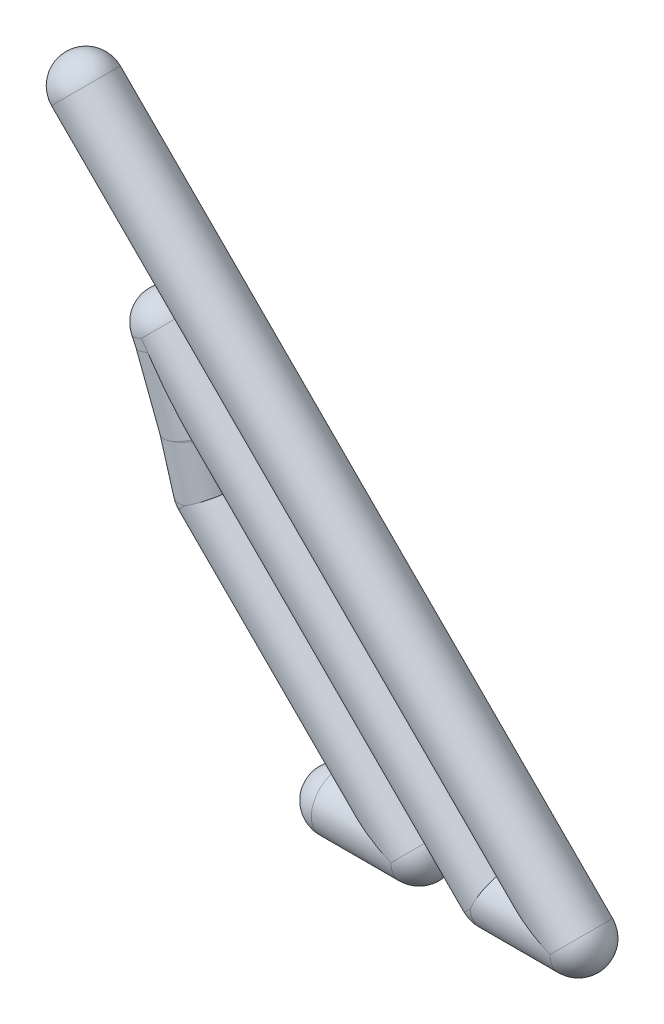
ISO-10303-21;
HEADER;
FILE_DESCRIPTION(('STEP AP214'),'2;1');
FILE_NAME('part.step','',(''),(''),'','','');
FILE_SCHEMA(('AUTOMOTIVE_DESIGN { 1 0 10303 214 1 1 1 1 }'));
ENDSEC;
DATA;
#1=APPLICATION_CONTEXT('core data for automotive mechanical design processes');
#2=APPLICATION_PROTOCOL_DEFINITION('international standard','automotive_design',2000,#1);
#3=PRODUCT_CONTEXT('',#1,'mechanical');
#4=PRODUCT('Part','Part','',(#3));
#5=PRODUCT_RELATED_PRODUCT_CATEGORY('part','',(#4));
#6=PRODUCT_DEFINITION_FORMATION('','',#4);
#7=PRODUCT_DEFINITION_CONTEXT('part definition',#1,'design');
#8=PRODUCT_DEFINITION('design','',#6,#7);
#9=PRODUCT_DEFINITION_SHAPE('','',#8);
#10=(LENGTH_UNIT() NAMED_UNIT(*) SI_UNIT(.MILLI.,.METRE.));
#11=(NAMED_UNIT(*) PLANE_ANGLE_UNIT() SI_UNIT($,.RADIAN.));
#12=(NAMED_UNIT(*) SI_UNIT($,.STERADIAN.) SOLID_ANGLE_UNIT());
#13=UNCERTAINTY_MEASURE_WITH_UNIT(LENGTH_MEASURE(1.E-05),#10,'distance_accuracy_value','');
#14=(GEOMETRIC_REPRESENTATION_CONTEXT(3) GLOBAL_UNCERTAINTY_ASSIGNED_CONTEXT((#13)) GLOBAL_UNIT_ASSIGNED_CONTEXT((#10,
#11,#12)) REPRESENTATION_CONTEXT('',''));
#15=CARTESIAN_POINT('',(0.,0.,0.));
#16=DIRECTION('',(0.,0.,1.));
#17=DIRECTION('',(1.,0.,0.));
#18=AXIS2_PLACEMENT_3D('',#15,#16,#17);
#19=CARTESIAN_POINT('',(15.78,-16.492,2.475));
#20=DIRECTION('',(-0.707106781186548,0.707106781186548,0.));
#21=DIRECTION('',(-0.707106781186548,-0.707106781186548,0.));
#22=AXIS2_PLACEMENT_3D('',#19,#20,#21);
#23=CYLINDRICAL_SURFACE('',#22,0.24);
#24=CARTESIAN_POINT('',(11.582,-12.294,2.475));
#25=DIRECTION('',(-0.707106781186548,0.707106781186548,0.));
#26=DIRECTION('',(-0.707106781186548,-0.707106781186548,0.));
#27=AXIS2_PLACEMENT_3D('',#24,#25,#26);
#28=CIRCLE('',#27,0.24);
#29=CARTESIAN_POINT('',(11.4122943725152,-12.4637056274848,2.475));
#30=VERTEX_POINT('',#29);
#31=EDGE_CURVE('E321',#30,#30,#28,.F.);
#32=ORIENTED_EDGE('',*,*,#31,.T.);
#33=EDGE_LOOP('',(#32));
#34=FACE_BOUND('',#33,.T.);
#35=CARTESIAN_POINT('',(15.78,-16.492,2.475));
#36=DIRECTION('',(0.38268343236509,0.923879532511287,0.));
#37=DIRECTION('',(-0.923879532511287,0.38268343236509,0.));
#38=AXIS2_PLACEMENT_3D('',#35,#36,#37);
#39=ELLIPSE('',#38,0.627150223140661,0.24);
#40=CARTESIAN_POINT('',(15.78,-16.492,2.715));
#41=VERTEX_POINT('',#40);
#42=CARTESIAN_POINT('',(15.78,-16.492,2.235));
#43=VERTEX_POINT('',#42);
#44=EDGE_CURVE('E12',#41,#43,#39,.F.);
#45=ORIENTED_EDGE('',*,*,#44,.F.);
#46=CARTESIAN_POINT('',(15.78,-16.492,2.475));
#47=DIRECTION('',(-0.707106781186547,0.707106781186548,0.));
#48=DIRECTION('',(-0.707106781186548,-0.707106781186547,0.));
#49=AXIS2_PLACEMENT_3D('',#46,#47,#48);
#50=CIRCLE('',#49,0.24);
#51=EDGE_CURVE('E298',#41,#43,#50,.T.);
#52=ORIENTED_EDGE('',*,*,#51,.T.);
#53=EDGE_LOOP('',(#45,#52));
#54=FACE_BOUND('',#53,.T.);
#55=CARTESIAN_POINT('',(12.0393039005138,-13.0902283468249,2.4878495781095));
#56=CARTESIAN_POINT('',(12.1524299571834,-13.2033745511837,2.48753672881311));
#57=CARTESIAN_POINT('',(12.2655569624466,-13.3165217046656,2.487272545384));
#58=CARTESIAN_POINT('',(12.8311943433347,-13.8822598284135,2.48603924299405));
#59=CARTESIAN_POINT('',(13.2837116934356,-14.3348577784387,2.48533296853145));
#60=CARTESIAN_POINT('',(13.9624524899331,-15.0137194662545,2.48170438851958));
#61=CARTESIAN_POINT('',(14.1886935709239,-15.2400008429269,2.48006666686748));
#62=CARTESIAN_POINT('',(14.5280994127774,-15.5794671363868,2.47944002725329));
#63=CARTESIAN_POINT('',(14.6412422883741,-15.6926301639063,2.47953613986878));
#64=CARTESIAN_POINT('',(14.7578709662125,-15.809279614508,2.47593903443946));
#65=CARTESIAN_POINT('',(14.7614051398877,-15.8128144176557,2.47582653042368));
#66=CARTESIAN_POINT('',(14.7667063606682,-15.8181165826379,2.47560125357452));
#67=CARTESIAN_POINT('',(14.7684734567371,-15.8198839934447,2.47551673929685));
#68=CARTESIAN_POINT('',(14.770679008299,-15.822089937838,2.47533368831303));
#69=CARTESIAN_POINT('',(14.7711199639117,-15.8225309719894,2.47529320651379));
#70=CARTESIAN_POINT('',(14.771780741807,-15.823191867576,2.47521204563451));
#71=CARTESIAN_POINT('',(14.7720009194677,-15.8234120844526,2.47518158053352));
#72=CARTESIAN_POINT('',(14.7722737258936,-15.8236849394681,2.4751192615739));
#73=CARTESIAN_POINT('',(14.7723281745299,-15.8237393978022,2.47510558354908));
#74=CARTESIAN_POINT('',(14.7724087442519,-15.8238199818746,2.47507721028868));
#75=CARTESIAN_POINT('',(14.7724354312566,-15.8238466736325,2.47506643511317));
#76=CARTESIAN_POINT('',(14.772467744564,-15.8238789926953,2.47504848788414));
#77=CARTESIAN_POINT('',(14.7724742443439,-15.8238854936328,2.47504461518583));
#78=CARTESIAN_POINT('',(14.772486591039,-15.823897842527,2.47503518233933));
#79=CARTESIAN_POINT('',(14.7724924462692,-15.8239036988,2.47502964831281));
#80=CARTESIAN_POINT('',(14.7724983767957,-15.8239096303828,2.4750216825582));
#81=CARTESIAN_POINT('',(14.7724992462219,-15.8239104999639,2.4750204410701));
#82=CARTESIAN_POINT('',(14.7725008948613,-15.8239121488969,2.47501784958273));
#83=CARTESIAN_POINT('',(14.7725016744121,-15.8239129285866,2.47501650002406));
#84=CARTESIAN_POINT('',(14.772503100867,-15.8239143552955,2.47501364917537));
#85=CARTESIAN_POINT('',(14.7725037469108,-15.8239150014544,2.47501214698896));
#86=CARTESIAN_POINT('',(14.7725048524285,-15.823916107169,2.47500898514142));
#87=CARTESIAN_POINT('',(14.7725053089725,-15.8239165637943,2.47500732346378));
#88=CARTESIAN_POINT('',(14.7725056359596,-15.8239168908396,2.475005598285));
#89=B_SPLINE_CURVE_WITH_KNOTS('',3,(#55,#56,#57,#58,#59,#60,#61,#62,#63,#64,#65,#66,#67,#68,#69,
#70,#71,#72,#73,#74,#75,#76,#77,#78,#79,#80,#81,#82,#83,#84,#85,#86,#87,#88),.UNSPECIFIED.,.F.,
.F.,(4,2,2,2,2,2,2,2,2,2,2,2,2,2,2,2,4),(0.,0.480000000731884,2.40000012987557,3.36000036645926,
3.84000239278193,3.85500253751842,3.86250285689826,3.86437800043716,3.86531580783986,
3.86555030657064,3.86566768448352,3.86569758579388,3.86572703960308,3.86573227709549,
3.86573749422714,3.8657427439962,3.86574807215659),.UNSPECIFIED.);
#90=CARTESIAN_POINT('',(14.7725018046118,-15.8239130588105,2.47501144259092));
#91=VERTEX_POINT('',#90);
#92=CARTESIAN_POINT('',(12.4635301856548,-13.5145301883429,2.48681097323635));
#93=VERTEX_POINT('',#92);
#94=EDGE_CURVE('E98',#91,#93,#89,.F.);
#95=ORIENTED_EDGE('',*,*,#94,.F.);
#96=CARTESIAN_POINT('',(12.0393039005138,-13.0902283468249,2.46215042189051));
#97=CARTESIAN_POINT('',(12.1524299571834,-13.2033745511837,2.46246327118689));
#98=CARTESIAN_POINT('',(12.2655569624466,-13.3165217046656,2.462727454616));
#99=CARTESIAN_POINT('',(12.8311943433347,-13.8822598284135,2.46396075700596));
#100=CARTESIAN_POINT('',(13.2837116934356,-14.3348577784387,2.46466703146856));
#101=CARTESIAN_POINT('',(13.9624524899331,-15.0137194662545,2.46829561148042));
#102=CARTESIAN_POINT('',(14.1886935709239,-15.2400008429269,2.46993333313251));
#103=CARTESIAN_POINT('',(14.5280994127774,-15.5794671363868,2.47055997274671));
#104=CARTESIAN_POINT('',(14.6412422883741,-15.6926301639063,2.47046386013123));
#105=CARTESIAN_POINT('',(14.7578709662125,-15.809279614508,2.47406096556055));
#106=CARTESIAN_POINT('',(14.7614051398877,-15.8128144176557,2.47417346957632));
#107=CARTESIAN_POINT('',(14.7667063606682,-15.8181165826379,2.47439874642548));
#108=CARTESIAN_POINT('',(14.7684734567371,-15.8198839934447,2.47448326070315));
#109=CARTESIAN_POINT('',(14.770679008299,-15.822089937838,2.47466631168697));
#110=CARTESIAN_POINT('',(14.7711199639117,-15.8225309719894,2.47470679348621));
#111=CARTESIAN_POINT('',(14.771780741807,-15.823191867576,2.47478795436549));
#112=CARTESIAN_POINT('',(14.7720009194677,-15.8234120844526,2.47481841946648));
#113=CARTESIAN_POINT('',(14.7722737258936,-15.8236849394681,2.4748807384261));
#114=CARTESIAN_POINT('',(14.7723281745299,-15.8237393978022,2.47489441645092));
#115=CARTESIAN_POINT('',(14.7724087442519,-15.8238199818746,2.47492278971132));
#116=CARTESIAN_POINT('',(14.7724354312566,-15.8238466736325,2.47493356488683));
#117=CARTESIAN_POINT('',(14.772467744564,-15.8238789926953,2.47495151211586));
#118=CARTESIAN_POINT('',(14.7724742443439,-15.8238854936328,2.47495538481417));
#119=CARTESIAN_POINT('',(14.772486591039,-15.823897842527,2.47496481766067));
#120=CARTESIAN_POINT('',(14.7724924462692,-15.8239036988,2.47497035168719));
#121=CARTESIAN_POINT('',(14.7724983767957,-15.8239096303828,2.4749783174418));
#122=CARTESIAN_POINT('',(14.7724992462219,-15.8239104999639,2.4749795589299));
#123=CARTESIAN_POINT('',(14.7725008948613,-15.8239121488969,2.47498215041727));
#124=CARTESIAN_POINT('',(14.7725016744121,-15.8239129285866,2.47498349997594));
#125=CARTESIAN_POINT('',(14.772503100867,-15.8239143552955,2.47498635082463));
#126=CARTESIAN_POINT('',(14.7725037469108,-15.8239150014544,2.47498785301104));
#127=CARTESIAN_POINT('',(14.7725048524285,-15.823916107169,2.47499101485858));
#128=CARTESIAN_POINT('',(14.7725053089725,-15.8239165637943,2.47499267653622));
#129=CARTESIAN_POINT('',(14.7725056359596,-15.8239168908396,2.474994401715));
#130=B_SPLINE_CURVE_WITH_KNOTS('',3,(#96,#97,#98,#99,#100,#101,#102,#103,#104,#105,#106,#107,
#108,#109,#110,#111,#112,#113,#114,#115,#116,#117,#118,#119,#120,#121,#122,#123,#124,#125,#126,
#127,#128,#129),.UNSPECIFIED.,.F.,.F.,(4,2,2,2,2,2,2,2,2,2,2,2,2,2,2,2,4),(0.,0.480000000731884,
2.40000012987557,3.36000036645926,3.84000239278193,3.85500253751842,3.86250285689826,
3.86437800043716,3.86531580783986,3.86555030657064,3.86566768448352,3.86569758579388,
3.86572703960308,3.86573227709549,3.86573749422714,3.8657427439962,3.86574807215659),.UNSPECIFIED.);
#131=CARTESIAN_POINT('',(12.4635301856548,-13.514530188343,2.4631890267633));
#132=VERTEX_POINT('',#131);
#133=EDGE_CURVE('E85',#132,#91,#130,.T.);
#134=ORIENTED_EDGE('',*,*,#133,.F.);
#135=CARTESIAN_POINT('',(12.4639358484132,-13.5149364095001,2.48680295689125));
#136=CARTESIAN_POINT('',(12.4631987723173,-13.5141972973782,2.48682937850623));
#137=CARTESIAN_POINT('',(12.4624571718997,-13.5134587462612,2.4867881558701));
#138=CARTESIAN_POINT('',(12.4609733066918,-13.5119904270471,2.4865640456576));
#139=CARTESIAN_POINT('',(12.4602310984285,-13.511260802041,2.48637985966248));
#140=CARTESIAN_POINT('',(12.4587670353833,-13.5098306726624,2.48586222887949));
#141=CARTESIAN_POINT('',(12.4580452247035,-13.5091302300351,2.48552848359803));
#142=CARTESIAN_POINT('',(12.4566479009671,-13.5077823214639,2.48470033894227));
#143=CARTESIAN_POINT('',(12.4559722348691,-13.5071346788663,2.48420650532086));
#144=CARTESIAN_POINT('',(12.4549171285198,-13.5061286090831,2.48324200875173));
#145=CARTESIAN_POINT('',(12.4545150701523,-13.5057467084271,2.4828205389861));
#146=CARTESIAN_POINT('',(12.4537607039294,-13.505032363729,2.481898063243));
#147=CARTESIAN_POINT('',(12.4534083358202,-13.5046998597624,2.48139715518576));
#148=CARTESIAN_POINT('',(12.4528353179219,-13.5041604862111,2.48042248855023));
#149=CARTESIAN_POINT('',(12.4526023855642,-13.5039417640439,2.47996258826228));
#150=CARTESIAN_POINT('',(12.4521939849588,-13.5035588661209,2.47899642802723));
#151=CARTESIAN_POINT('',(12.452018485011,-13.5033946602741,2.47849019385236));
#152=CARTESIAN_POINT('',(12.4517363797707,-13.5031309546922,2.47743723003212));
#153=CARTESIAN_POINT('',(12.4516303898041,-13.5030320328257,2.47689018522285));
#154=CARTESIAN_POINT('',(12.4514998026473,-13.5029101799448,2.47577824838828));
#155=CARTESIAN_POINT('',(12.4514751320015,-13.50288718035,2.47521337293532));
#156=CARTESIAN_POINT('',(12.4515069903254,-13.5029168971568,2.47416816217031));
#157=CARTESIAN_POINT('',(12.4515525644539,-13.5029593984269,2.47368713313492));
#158=CARTESIAN_POINT('',(12.4517018593904,-13.5030987552891,2.47274241084046));
#159=CARTESIAN_POINT('',(12.4518055861321,-13.5031956164279,2.4722787193556));
#160=CARTESIAN_POINT('',(12.4520651619385,-13.5034383403056,2.47137673208784));
#161=CARTESIAN_POINT('',(12.4522213232091,-13.5035844965817,2.47093860732517));
#162=CARTESIAN_POINT('',(12.4525771509879,-13.5039181058968,2.47009740209588));
#163=CARTESIAN_POINT('',(12.4527768377488,-13.5041055781609,2.4696943380659));
#164=CARTESIAN_POINT('',(12.453320490076,-13.5046170282519,2.46873401134771));
#165=CARTESIAN_POINT('',(12.4536866298877,-13.5049623508091,2.46820061026836));
#166=CARTESIAN_POINT('',(12.4544750207811,-13.505708669451,2.46722140318395));
#167=CARTESIAN_POINT('',(12.4548973959513,-13.5061097887466,2.46677579645888));
#168=CARTESIAN_POINT('',(12.455949994154,-13.5071134784674,2.46581414914046));
#169=CARTESIAN_POINT('',(12.4565978365707,-13.5077343387704,2.4653365648124));
#170=CARTESIAN_POINT('',(12.4579365796717,-13.5090251479475,2.46452946027233));
#171=CARTESIAN_POINT('',(12.4586275888467,-13.5096952213164,2.46420033174139));
#172=CARTESIAN_POINT('',(12.4600869823975,-13.5111193788772,2.46365973550469));
#173=CARTESIAN_POINT('',(12.4608571546831,-13.5118759096217,2.46345968139108));
#174=CARTESIAN_POINT('',(12.4623985729549,-13.5134003827393,2.46321527796484));
#175=CARTESIAN_POINT('',(12.4631697592889,-13.5141681823022,2.46316967580611));
#176=CARTESIAN_POINT('',(12.4639358484132,-13.5149364095001,2.46319704310864));
#177=B_SPLINE_CURVE_WITH_KNOTS('',3,(#135,#136,#137,#138,#139,#140,#141,#142,#143,#144,#145,
#146,#147,#148,#149,#150,#151,#152,#153,#154,#155,#156,#157,#158,#159,#160,#161,#162,#163,#164,
#165,#166,#167,#168,#169,#170,#171,#172,#173,#174,#175,#176),.UNSPECIFIED.,.F.,.F.,(4,2,2,2,2,2,
2,2,2,2,2,2,2,2,2,2,2,2,2,2,4),(0.,0.00313198407615698,0.00629275107383918,0.00945989733780664,
0.0126159707307906,0.0146991402544303,0.0167797616213369,0.0184533603700822,0.020126033808029,
0.0218133213112893,0.0234990842758988,0.0249472415691489,0.0263955466544461,0.0278526328508719,
0.0293103984956399,0.0314981873519733,0.0336908863523824,0.036723929795061,0.0397649293748683,
0.0430473194972195,0.0463030197179651),.UNSPECIFIED.);
#178=EDGE_CURVE('E102',#93,#132,#177,.T.);
#179=ORIENTED_EDGE('',*,*,#178,.F.);
#180=EDGE_LOOP('',(#95,#134,#179));
#181=FACE_BOUND('',#180,.T.);
#182=ADVANCED_FACE('F81',(#34,#54,#181),#23,.T.);
#183=CARTESIAN_POINT('',(11.582,-12.294,2.475));
#184=DIRECTION('',(1.,0.,0.));
#185=DIRECTION('',(0.,-1.,0.));
#186=AXIS2_PLACEMENT_3D('',#183,#184,#185);
#187=SPHERICAL_SURFACE('',#186,0.24);
#188=CARTESIAN_POINT('',(11.582,-12.294,2.475));
#189=DIRECTION('',(-0.707106781186548,0.707106781186548,0.));
#190=DIRECTION('',(-0.707106781186548,-0.707106781186548,0.));
#191=AXIS2_PLACEMENT_3D('',#188,#189,#190);
#192=SPHERICAL_SURFACE('',#191,0.24);
#193=ORIENTED_EDGE('',*,*,#31,.F.);
#194=EDGE_LOOP('',(#193));
#195=FACE_BOUND('',#194,.T.);
#196=ADVANCED_FACE('F83',(#195),#192,.T.);
#197=CARTESIAN_POINT('',(15.78,-16.492,2.475));
#198=DIRECTION('',(1.,0.,0.));
#199=DIRECTION('',(0.,-1.,0.));
#200=AXIS2_PLACEMENT_3D('',#197,#198,#199);
#201=SPHERICAL_SURFACE('',#200,0.24);
#202=ORIENTED_EDGE('',*,*,#51,.F.);
#203=CARTESIAN_POINT('',(15.78,-16.492,2.475));
#204=DIRECTION('',(1.,0.,0.));
#205=DIRECTION('',(0.,0.,-1.));
#206=AXIS2_PLACEMENT_3D('',#203,#204,#205);
#207=CIRCLE('',#206,0.24);
#208=EDGE_CURVE('E292',#43,#41,#207,.F.);
#209=ORIENTED_EDGE('',*,*,#208,.F.);
#210=EDGE_LOOP('',(#202,#209));
#211=FACE_BOUND('',#210,.T.);
#212=ADVANCED_FACE('F312',(#211),#201,.T.);
#213=CARTESIAN_POINT('',(15.101,-16.492,2.475));
#214=DIRECTION('',(1.,0.,0.));
#215=DIRECTION('',(0.,0.,-1.));
#216=AXIS2_PLACEMENT_3D('',#213,#214,#215);
#217=CYLINDRICAL_SURFACE('',#216,0.24);
#218=CARTESIAN_POINT('',(15.101,-16.492,2.475));
#219=DIRECTION('',(0.923845451962555,-0.382765699727786,0.));
#220=DIRECTION('',(0.382765699727786,0.923845451962556,0.));
#221=AXIS2_PLACEMENT_3D('',#218,#219,#220);
#222=ELLIPSE('',#221,0.259783711106831,0.24);
#223=CARTESIAN_POINT('',(15.101,-16.492,2.715));
#224=VERTEX_POINT('',#223);
#225=CARTESIAN_POINT('',(15.101,-16.492,2.235));
#226=VERTEX_POINT('',#225);
#227=EDGE_CURVE('E295',#224,#226,#222,.F.);
#228=ORIENTED_EDGE('',*,*,#227,.F.);
#229=CARTESIAN_POINT('',(15.101,-16.492,2.475));
#230=DIRECTION('',(1.,0.,0.));
#231=DIRECTION('',(0.,0.,-1.));
#232=AXIS2_PLACEMENT_3D('',#229,#230,#231);
#233=CIRCLE('',#232,0.24);
#234=EDGE_CURVE('E290',#224,#226,#233,.T.);
#235=ORIENTED_EDGE('',*,*,#234,.T.);
#236=EDGE_LOOP('',(#228,#235));
#237=FACE_BOUND('',#236,.T.);
#238=ORIENTED_EDGE('',*,*,#208,.T.);
#239=ORIENTED_EDGE('',*,*,#44,.T.);
#240=EDGE_LOOP('',(#238,#239));
#241=FACE_BOUND('',#240,.T.);
#242=ADVANCED_FACE('F438',(#237,#241),#217,.T.);
#243=CARTESIAN_POINT('',(15.101,-16.492,2.475));
#244=DIRECTION('',(1.,0.,0.));
#245=DIRECTION('',(0.,-1.,0.));
#246=AXIS2_PLACEMENT_3D('',#243,#244,#245);
#247=SPHERICAL_SURFACE('',#246,0.24);
#248=ORIENTED_EDGE('',*,*,#234,.F.);
#249=CARTESIAN_POINT('',(15.101,-16.492,2.475));
#250=DIRECTION('',(0.706980838223797,-0.70723270172156,0.));
#251=DIRECTION('',(0.707232701721561,0.706980838223797,0.));
#252=AXIS2_PLACEMENT_3D('',#249,#250,#251);
#253=CIRCLE('',#252,0.24);
#254=EDGE_CURVE('E252',#226,#224,#253,.F.);
#255=ORIENTED_EDGE('',*,*,#254,.F.);
#256=EDGE_LOOP('',(#248,#255));
#257=FACE_BOUND('',#256,.T.);
#258=ADVANCED_FACE('F432',(#257),#247,.T.);
#259=CARTESIAN_POINT('',(12.294,-13.684,2.475));
#260=DIRECTION('',(0.706980838223797,-0.70723270172156,0.));
#261=DIRECTION('',(0.707232701721561,0.706980838223797,0.));
#262=AXIS2_PLACEMENT_3D('',#259,#260,#261);
#263=CYLINDRICAL_SURFACE('',#262,0.24);
#264=CARTESIAN_POINT('',(12.294,-13.684,2.475));
#265=DIRECTION('',(0.818362087522628,0.574702961281396,0.));
#266=DIRECTION('',(0.574702961281396,-0.818362087522628,0.));
#267=AXIS2_PLACEMENT_3D('',#264,#265,#266);
#268=ELLIPSE('',#267,1.39439556830279,0.24);
#269=CARTESIAN_POINT('',(12.294,-13.684,2.235));
#270=VERTEX_POINT('',#269);
#271=CARTESIAN_POINT('',(12.3475021843209,-13.7601857206203,2.23553548854484));
#272=VERTEX_POINT('',#271);
#273=EDGE_CURVE('E257',#270,#272,#268,.F.);
#274=ORIENTED_EDGE('',*,*,#273,.F.);
#275=CARTESIAN_POINT('',(12.294,-13.684,2.475));
#276=DIRECTION('',(0.706980838223797,-0.70723270172156,0.));
#277=DIRECTION('',(0.70723270172156,0.706980838223797,0.));
#278=AXIS2_PLACEMENT_3D('',#275,#276,#277);
#279=CIRCLE('',#278,0.24);
#280=EDGE_CURVE('E249',#270,#132,#279,.T.);
#281=ORIENTED_EDGE('',*,*,#280,.T.);
#282=ORIENTED_EDGE('',*,*,#133,.T.);
#283=ORIENTED_EDGE('',*,*,#94,.T.);
#284=CARTESIAN_POINT('',(12.294,-13.684,2.715));
#285=VERTEX_POINT('',#284);
#286=EDGE_CURVE('E248',#93,#285,#279,.T.);
#287=ORIENTED_EDGE('',*,*,#286,.T.);
#288=CARTESIAN_POINT('',(12.3475021843209,-13.7601857206203,2.71446451145516));
#289=VERTEX_POINT('',#288);
#290=EDGE_CURVE('E255',#289,#285,#268,.F.);
#291=ORIENTED_EDGE('',*,*,#290,.F.);
#292=CARTESIAN_POINT('',(12.3512972346505,-13.7672000000029,2.71430142332243));
#293=CARTESIAN_POINT('',(12.3505896999158,-13.7654506455223,2.71435727997294));
#294=CARTESIAN_POINT('',(12.3497459392057,-13.7637500847709,2.71440054885869));
#295=CARTESIAN_POINT('',(12.3477927691306,-13.7605148786719,2.71446325130046));
#296=CARTESIAN_POINT('',(12.3466839693351,-13.7589798641683,2.71448273893262));
#297=CARTESIAN_POINT('',(12.3441969268719,-13.7561271120126,2.71449951003613));
#298=CARTESIAN_POINT('',(12.3428171298655,-13.7548107126878,2.7144966615425));
#299=CARTESIAN_POINT('',(12.3398462408116,-13.75245054114,2.71446823439413));
#300=CARTESIAN_POINT('',(12.3382553518889,-13.7514065096581,2.71444267745775));
#301=CARTESIAN_POINT('',(12.3353630190706,-13.74982473294,2.71437712322332));
#302=CARTESIAN_POINT('',(12.3340945474018,-13.74922597786,2.71434264323666));
#303=CARTESIAN_POINT('',(12.3327999999995,-13.7487000360046,2.71430121461824));
#304=B_SPLINE_CURVE_WITH_KNOTS('',3,(#292,#293,#294,#295,#296,#297,#298,#299,#300,#301,#302,
#303),.UNSPECIFIED.,.F.,.F.,(4,2,2,2,2,4),(0.,0.00566668208227649,0.0113204545520082,
0.0170076553668594,0.0226894227874552,0.0268867331951387),.UNSPECIFIED.);
#305=CARTESIAN_POINT('',(12.3481927950135,-13.7612096425539,2.71444863904463));
#306=VERTEX_POINT('',#305);
#307=EDGE_CURVE('E203',#306,#289,#304,.T.);
#308=ORIENTED_EDGE('',*,*,#307,.F.);
#309=CARTESIAN_POINT('',(12.3059058378624,-13.6959100793436,2.475));
#310=DIRECTION('',(0.839369015949132,0.543562006641916,0.));
#311=DIRECTION('',(0.543562006641915,-0.839369015949132,0.));
#312=AXIS2_PLACEMENT_3D('',#309,#310,#311);
#313=ELLIPSE('',#312,1.14836390891025,0.24);
#314=CARTESIAN_POINT('',(12.6759483076814,-14.2673300460742,2.66828037472497));
#315=VERTEX_POINT('',#314);
#316=EDGE_CURVE('E194',#315,#306,#313,.F.);
#317=ORIENTED_EDGE('',*,*,#316,.F.);
#318=CARTESIAN_POINT('',(12.7024780718465,-14.3182,2.6543507864497));
#319=CARTESIAN_POINT('',(12.69771987641,-14.306610555522,2.65861577034415));
#320=CARTESIAN_POINT('',(12.6921657520016,-14.2950297868883,2.66208179574257));
#321=CARTESIAN_POINT('',(12.6795944504754,-14.2726112803398,2.66748150140746));
#322=CARTESIAN_POINT('',(12.672606476876,-14.2617637156115,2.66944254236587));
#323=CARTESIAN_POINT('',(12.6624084846489,-14.2481372367059,2.67115785247798));
#324=CARTESIAN_POINT('',(12.6598790232747,-14.2449089766992,2.67150445367551));
#325=CARTESIAN_POINT('',(12.654657429442,-14.2385425674204,2.67206899318749));
#326=CARTESIAN_POINT('',(12.6519644145487,-14.2354050725672,2.67228614958679));
#327=CARTESIAN_POINT('',(12.6491993853876,-14.2323272717522,2.67243827944999));
#328=B_SPLINE_CURVE_WITH_KNOTS('',3,(#318,#319,#320,#321,#322,#323,#324,#325,#326,#327),
.UNSPECIFIED.,.F.,.F.,(4,2,2,2,4),(0.,0.039698903756807,0.0786577620085021,0.0910003747181637,
0.103416807080208),.UNSPECIFIED.);
#329=CARTESIAN_POINT('',(12.6820744631162,-14.2772137391823,2.66629760750582));
#330=VERTEX_POINT('',#329);
#331=EDGE_CURVE('E334',#330,#315,#328,.T.);
#332=ORIENTED_EDGE('',*,*,#331,.F.);
#333=CARTESIAN_POINT('',(12.3832512894844,-13.773283085455,2.475));
#334=DIRECTION('',(0.860143573998323,0.510051989614188,0.));
#335=DIRECTION('',(0.510051989614188,-0.860143573998323,0.));
#336=AXIS2_PLACEMENT_3D('',#333,#334,#335);
#337=ELLIPSE('',#336,0.970169007662572,0.24);
#338=CARTESIAN_POINT('',(12.878021568807,-14.607655825941,2.47893017614097));
#339=VERTEX_POINT('',#338);
#340=EDGE_CURVE('E339',#339,#330,#337,.F.);
#341=ORIENTED_EDGE('',*,*,#340,.F.);
#342=CARTESIAN_POINT('',(14.9314698156829,-16.6614698103198,2.48681101162417));
#343=CARTESIAN_POINT('',(14.8183428237852,-16.5483226705782,2.48651698186133));
#344=CARTESIAN_POINT('',(14.7052160426608,-16.4351757412739,2.48621903358582));
#345=CARTESIAN_POINT('',(14.1395826740654,-15.8694416304949,2.48466872854587));
#346=CARTESIAN_POINT('',(13.6870779045962,-15.4168562632065,2.48323468130219));
#347=CARTESIAN_POINT('',(13.1214421906677,-14.8511198034464,2.48054433337101));
#348=CARTESIAN_POINT('',(13.0083148025991,-14.7379722662823,2.4799613742963));
#349=CARTESIAN_POINT('',(12.8386294287434,-14.568256669739,2.47860940355299));
#350=CARTESIAN_POINT('',(12.7820685734551,-14.5116857403781,2.47807915774092));
#351=CARTESIAN_POINT('',(12.6972218592025,-14.4268239140547,2.47720353627049));
#352=CARTESIAN_POINT('',(12.6689386405468,-14.3985356578684,2.47689828606823));
#353=CARTESIAN_POINT('',(12.6371303241977,-14.3667216761321,2.47594180067841));
#354=CARTESIAN_POINT('',(12.6335961990328,-14.3631869215033,2.47582700915081));
#355=CARTESIAN_POINT('',(12.62829497629,-14.3578847545584,2.47560110385886));
#356=CARTESIAN_POINT('',(12.6265278671399,-14.3561173306681,2.47551684726686));
#357=CARTESIAN_POINT('',(12.6243223312181,-14.3539114019178,2.47533379765358));
#358=CARTESIAN_POINT('',(12.6238813803823,-14.3534703725441,2.47529330009577));
#359=CARTESIAN_POINT('',(12.6232205869151,-14.3528094613827,2.47521225167761));
#360=CARTESIAN_POINT('',(12.6230004004818,-14.352589235732,2.47518184680172));
#361=CARTESIAN_POINT('',(12.6227275995866,-14.3523163862482,2.47511957419025));
#362=CARTESIAN_POINT('',(12.6226731531772,-14.3522619301413,2.47510590407467));
#363=CARTESIAN_POINT('',(12.6225925506307,-14.3521813132386,2.47507773134989));
#364=CARTESIAN_POINT('',(12.6225658473644,-14.3521546052163,2.47506705497383));
#365=CARTESIAN_POINT('',(12.6225335192993,-14.3521222713931,2.47504924471142));
#366=CARTESIAN_POINT('',(12.622527029893,-14.352115780831,2.47504540913036));
#367=CARTESIAN_POINT('',(12.6225146436659,-14.3521033923978,2.47503616353439));
#368=CARTESIAN_POINT('',(12.6225087405355,-14.3520974882161,2.475030773475));
#369=CARTESIAN_POINT('',(12.6225025931524,-14.352091339738,2.4750229965608));
#370=CARTESIAN_POINT('',(12.6225016465445,-14.3520903929615,2.47502172568042));
#371=CARTESIAN_POINT('',(12.6224998445067,-14.3520885906028,2.47501906741477));
#372=CARTESIAN_POINT('',(12.6224989887284,-14.352087734672,2.47501768051415));
#373=CARTESIAN_POINT('',(12.6224974110944,-14.3520861567571,2.47501474213787));
#374=CARTESIAN_POINT('',(12.6224966901327,-14.3520854356669,2.47501318966402));
#375=CARTESIAN_POINT('',(12.6224954382964,-14.3520841836077,2.4750099107778));
#376=CARTESIAN_POINT('',(12.6224949103879,-14.3520836556052,2.47500818213435));
#377=CARTESIAN_POINT('',(12.6224945156532,-14.3520832608002,2.47500638012172));
#378=B_SPLINE_CURVE_WITH_KNOTS('',3,(#342,#343,#344,#345,#346,#347,#348,#349,#350,#351,#352,
#353,#354,#355,#356,#357,#358,#359,#360,#361,#362,#363,#364,#365,#366,#367,#368,#369,#370,#371,
#372,#373,#374,#375,#376,#377),.UNSPECIFIED.,.F.,.F.,(4,2,2,2,2,2,2,2,2,2,2,2,2,2,2,2,2,4),(0.,
0.48000000124425,2.40000029887847,2.88000041672578,3.12000060615711,3.24000134021893,
3.25500148491391,3.26250180403167,3.26437694722658,3.26531475266413,3.26554924920094,
3.26566661948691,3.26569643695495,3.26572588749487,3.26573142074869,3.2657369319431,
3.26574247847312,3.2657481069549),.UNSPECIFIED.);
#379=CARTESIAN_POINT('',(14.5925301856547,-16.3224698143453,2.48591019265634));
#380=VERTEX_POINT('',#379);
#381=EDGE_CURVE('E341',#380,#339,#378,.T.);
#382=ORIENTED_EDGE('',*,*,#381,.F.);
#383=CARTESIAN_POINT('',(14.5921543946064,-16.3220943725153,2.46409731526774));
#384=CARTESIAN_POINT('',(14.5927990476481,-16.3227376222487,2.46407397757091));
#385=CARTESIAN_POINT('',(14.5934433070484,-16.3233843238212,2.46410651362236));
#386=CARTESIAN_POINT('',(14.5947241527957,-16.3246772527908,2.46428781123502));
#387=CARTESIAN_POINT('',(14.5953606621413,-16.3253234498343,2.46443732621294));
#388=CARTESIAN_POINT('',(14.5966114049076,-16.3266002991643,2.46485778671681));
#389=CARTESIAN_POINT('',(14.5972256032117,-16.3272309264842,2.46512891540434));
#390=CARTESIAN_POINT('',(14.5984146813006,-16.3284582380469,2.4658010345371));
#391=CARTESIAN_POINT('',(14.5989896437721,-16.329054993196,2.46620174098436));
#392=CARTESIAN_POINT('',(14.5999339497249,-16.3300397352028,2.46701850112302));
#393=CARTESIAN_POINT('',(14.6003173312479,-16.3304410579976,2.46740217809416));
#394=CARTESIAN_POINT('',(14.6010384604879,-16.3311982899047,2.46824960730095));
#395=CARTESIAN_POINT('',(14.6013762601285,-16.331554250664,2.46871326703));
#396=CARTESIAN_POINT('',(14.6019241885895,-16.3321331167566,2.46961512200001));
#397=CARTESIAN_POINT('',(14.6021462260093,-16.3323682597177,2.47003815461667));
#398=CARTESIAN_POINT('',(14.6025399331537,-16.3327858720736,2.47093125551545));
#399=CARTESIAN_POINT('',(14.6027116638651,-16.3329684052429,2.47140126591104));
#400=CARTESIAN_POINT('',(14.6029723227325,-16.3332457487166,2.47230651692507));
#401=CARTESIAN_POINT('',(14.603069771776,-16.3333495729889,2.47273651717068));
#402=CARTESIAN_POINT('',(14.6032137811903,-16.3335030706601,2.47361439751246));
#403=CARTESIAN_POINT('',(14.6032603700431,-16.3335527743668,2.47406226745569));
#404=CARTESIAN_POINT('',(14.6032993547818,-16.3335943625722,2.47496407689919));
#405=CARTESIAN_POINT('',(14.6032916316605,-16.3335861201004,2.47541802755141));
#406=CARTESIAN_POINT('',(14.6032223014547,-16.3335121701116,2.47631701399338));
#407=CARTESIAN_POINT('',(14.6031606824612,-16.333446449894,2.47676204779057));
#408=CARTESIAN_POINT('',(14.6029904134509,-16.3332650373738,2.4776183593764));
#409=CARTESIAN_POINT('',(14.6028831606234,-16.3331508298363,2.47803023884564));
#410=CARTESIAN_POINT('',(14.6026280341904,-16.3328795320975,2.47882615028155));
#411=CARTESIAN_POINT('',(14.6024801428964,-16.3327224232228,2.47921017002959));
#412=CARTESIAN_POINT('',(14.6020807133591,-16.3322988154359,2.48010089885758));
#413=CARTESIAN_POINT('',(14.6018117554628,-16.3320141130837,2.48059116429912));
#414=CARTESIAN_POINT('',(14.6012221907531,-16.3313918777659,2.48150191457812));
#415=CARTESIAN_POINT('',(14.6009014910964,-16.3310542498644,2.48192227116771));
#416=CARTESIAN_POINT('',(14.6000938856879,-16.330206823384,2.4828399205835));
#417=CARTESIAN_POINT('',(14.5995898985953,-16.3296801005987,2.48330648101669));
#418=CARTESIAN_POINT('',(14.5985335099507,-16.3285815707222,2.48411897476856));
#419=CARTESIAN_POINT('',(14.5979809269091,-16.3280095955016,2.48446442959828));
#420=CARTESIAN_POINT('',(14.5965747640599,-16.3265618315044,2.48518017065556));
#421=CARTESIAN_POINT('',(14.5957030212092,-16.3256709263918,2.48548412736442));
#422=CARTESIAN_POINT('',(14.5939381660419,-16.3238814985864,2.48585959411276));
#423=CARTESIAN_POINT('',(14.5930454166335,-16.3229831825887,2.48593374726671));
#424=CARTESIAN_POINT('',(14.5921543946075,-16.3220943725164,2.48590268473648));
#425=B_SPLINE_CURVE_WITH_KNOTS('',3,(#383,#384,#385,#386,#387,#388,#389,#390,#391,#392,#393,
#394,#395,#396,#397,#398,#399,#400,#401,#402,#403,#404,#405,#406,#407,#408,#409,#410,#411,#412,
#413,#414,#415,#416,#417,#418,#419,#420,#421,#422,#423,#424),.UNSPECIFIED.,.F.,.F.,(4,2,2,2,2,2,
2,2,2,2,2,2,2,2,2,2,2,2,2,2,4),(0.,0.0027323724266401,0.00548248935988505,0.00823676220559053,
0.0109850389160248,0.0130029722409455,0.0150185871205046,0.0166101761659934,0.0181998276654848,
0.0195528270053464,0.0209050682687729,0.022260273456328,0.0236157781728873,0.0249324698709291,
0.026249735591709,0.0281217788984898,0.0299972194678809,0.032579642465643,0.0351721565889498,
0.0389976623378212,0.0427790020940546),.UNSPECIFIED.);
#426=CARTESIAN_POINT('',(14.5925301856548,-16.3224698143452,2.4640898073481));
#427=VERTEX_POINT('',#426);
#428=EDGE_CURVE('E348',#427,#380,#425,.T.);
#429=ORIENTED_EDGE('',*,*,#428,.F.);
#430=CARTESIAN_POINT('',(14.9314698156829,-16.6614698103198,2.46318898837583));
#431=CARTESIAN_POINT('',(14.8183428237852,-16.5483226705782,2.46348301813867));
#432=CARTESIAN_POINT('',(14.7052160426608,-16.4351757412739,2.46378096641418));
#433=CARTESIAN_POINT('',(14.1395826740654,-15.8694416304949,2.46533127145413));
#434=CARTESIAN_POINT('',(13.6870779045962,-15.4168562632065,2.46676531869781));
#435=CARTESIAN_POINT('',(13.1214421906677,-14.8511198034464,2.46945566662899));
#436=CARTESIAN_POINT('',(13.0083148025991,-14.7379722662823,2.4700386257037));
#437=CARTESIAN_POINT('',(12.8386294287434,-14.568256669739,2.47139059644701));
#438=CARTESIAN_POINT('',(12.7820685734551,-14.5116857403781,2.47192084225908));
#439=CARTESIAN_POINT('',(12.6972218592025,-14.4268239140547,2.47279646372951));
#440=CARTESIAN_POINT('',(12.6689386405468,-14.3985356578684,2.47310171393177));
#441=CARTESIAN_POINT('',(12.6371303241977,-14.3667216761321,2.47405819932159));
#442=CARTESIAN_POINT('',(12.6335961990328,-14.3631869215033,2.47417299084919));
#443=CARTESIAN_POINT('',(12.62829497629,-14.3578847545584,2.47439889614114));
#444=CARTESIAN_POINT('',(12.6265278671399,-14.3561173306681,2.47448315273314));
#445=CARTESIAN_POINT('',(12.6243223312181,-14.3539114019178,2.47466620234642));
#446=CARTESIAN_POINT('',(12.6238813803823,-14.3534703725441,2.47470669990423));
#447=CARTESIAN_POINT('',(12.6232205869151,-14.3528094613827,2.47478774832239));
#448=CARTESIAN_POINT('',(12.6230004004818,-14.352589235732,2.47481815319828));
#449=CARTESIAN_POINT('',(12.6227275995866,-14.3523163862482,2.47488042580975));
#450=CARTESIAN_POINT('',(12.6226731531772,-14.3522619301413,2.47489409592534));
#451=CARTESIAN_POINT('',(12.6225925506307,-14.3521813132386,2.47492226865011));
#452=CARTESIAN_POINT('',(12.6225658473644,-14.3521546052163,2.47493294502617));
#453=CARTESIAN_POINT('',(12.6225335192993,-14.3521222713931,2.47495075528858));
#454=CARTESIAN_POINT('',(12.622527029893,-14.352115780831,2.47495459086964));
#455=CARTESIAN_POINT('',(12.6225146436659,-14.3521033923978,2.47496383646561));
#456=CARTESIAN_POINT('',(12.6225087405355,-14.3520974882161,2.474969226525));
#457=CARTESIAN_POINT('',(12.6225025931524,-14.352091339738,2.47497700343921));
#458=CARTESIAN_POINT('',(12.6225016465445,-14.3520903929615,2.47497827431958));
#459=CARTESIAN_POINT('',(12.6224998445067,-14.3520885906028,2.47498093258523));
#460=CARTESIAN_POINT('',(12.6224989887284,-14.352087734672,2.47498231948585));
#461=CARTESIAN_POINT('',(12.6224974110944,-14.3520861567571,2.47498525786213));
#462=CARTESIAN_POINT('',(12.6224966901327,-14.3520854356669,2.47498681033598));
#463=CARTESIAN_POINT('',(12.6224954382964,-14.3520841836077,2.4749900892222));
#464=CARTESIAN_POINT('',(12.6224949103879,-14.3520836556052,2.47499181786565));
#465=CARTESIAN_POINT('',(12.6224945156532,-14.3520832608002,2.47499361987828));
#466=B_SPLINE_CURVE_WITH_KNOTS('',3,(#430,#431,#432,#433,#434,#435,#436,#437,#438,#439,#440,
#441,#442,#443,#444,#445,#446,#447,#448,#449,#450,#451,#452,#453,#454,#455,#456,#457,#458,#459,
#460,#461,#462,#463,#464,#465),.UNSPECIFIED.,.F.,.F.,(4,2,2,2,2,2,2,2,2,2,2,2,2,2,2,2,2,4),(0.,
0.48000000124425,2.40000029887847,2.88000041672578,3.12000060615711,3.24000134021893,
3.25500148491391,3.26250180403167,3.26437694722658,3.26531475266413,3.26554924920094,
3.26566661948691,3.26569643695495,3.26572588749487,3.26573142074869,3.2657369319431,
3.26574247847312,3.2657481069549),.UNSPECIFIED.);
#467=CARTESIAN_POINT('',(12.878021568807,-14.607655825941,2.47106982385903));
#468=VERTEX_POINT('',#467);
#469=EDGE_CURVE('E363',#468,#427,#466,.F.);
#470=ORIENTED_EDGE('',*,*,#469,.F.);
#471=CARTESIAN_POINT('',(12.6820744631162,-14.2772137391823,2.28370239249418));
#472=VERTEX_POINT('',#471);
#473=EDGE_CURVE('E342',#472,#468,#337,.F.);
#474=ORIENTED_EDGE('',*,*,#473,.F.);
#475=CARTESIAN_POINT('',(12.6491993853665,-14.2323272717656,2.27756172056901));
#476=CARTESIAN_POINT('',(12.6580730919424,-14.2421505950398,2.2780558214744));
#477=CARTESIAN_POINT('',(12.6661595635257,-14.2526411378671,2.27920091519429));
#478=CARTESIAN_POINT('',(12.6806163592753,-14.2742485365536,2.28286741643227));
#479=CARTESIAN_POINT('',(12.687015094587,-14.2853506206929,2.28536353943276));
#480=CARTESIAN_POINT('',(12.6944293746019,-14.3001743360528,2.28961256070809));
#481=CARTESIAN_POINT('',(12.696136041306,-14.3037562919755,2.29070814542915));
#482=CARTESIAN_POINT('',(12.6994119387437,-14.3109582421271,2.29305835451472));
#483=CARTESIAN_POINT('',(12.7009803132318,-14.3145783364428,2.29431386603974));
#484=CARTESIAN_POINT('',(12.70247807186,-14.3181999999966,2.29564921353875));
#485=B_SPLINE_CURVE_WITH_KNOTS('',3,(#475,#476,#477,#478,#479,#480,#481,#482,#483,#484),
.UNSPECIFIED.,.F.,.F.,(4,2,2,2,4),(0.,0.0396851610798635,0.0786520741039964,0.090996956882148,
0.103413573795143),.UNSPECIFIED.);
#486=CARTESIAN_POINT('',(12.6759483076814,-14.2673300460742,2.28171962527503));
#487=VERTEX_POINT('',#486);
#488=EDGE_CURVE('E284',#487,#472,#485,.T.);
#489=ORIENTED_EDGE('',*,*,#488,.F.);
#490=CARTESIAN_POINT('',(12.3481927950135,-13.7612096425539,2.23555136095537));
#491=VERTEX_POINT('',#490);
#492=EDGE_CURVE('E283',#491,#487,#313,.F.);
#493=ORIENTED_EDGE('',*,*,#492,.F.);
#494=CARTESIAN_POINT('',(12.3327999999995,-13.7487000360045,2.23569878538176));
#495=CARTESIAN_POINT('',(12.3345492277567,-13.7494078883755,2.23564289644712));
#496=CARTESIAN_POINT('',(12.3362496557853,-13.7502519242326,2.23559959705145));
#497=CARTESIAN_POINT('',(12.3394845959558,-13.7522055911959,2.23553683555965));
#498=CARTESIAN_POINT('',(12.3410194756762,-13.7533146155427,2.23551731961905));
#499=CARTESIAN_POINT('',(12.3438719368285,-13.7558020790252,2.23550049301198));
#500=CARTESIAN_POINT('',(12.3451881787464,-13.7571820734848,2.23550331441953));
#501=CARTESIAN_POINT('',(12.3475479709753,-13.7601533403762,2.23553168698903));
#502=CARTESIAN_POINT('',(12.3485917817115,-13.7617444088247,2.23555721634007));
#503=CARTESIAN_POINT('',(12.3501730564266,-13.7646369454102,2.23562271903537));
#504=CARTESIAN_POINT('',(12.3507715589014,-13.7659054388224,2.23565717442239));
#505=CARTESIAN_POINT('',(12.3512972346505,-13.7672000000029,2.23569857667756));
#506=B_SPLINE_CURVE_WITH_KNOTS('',3,(#494,#495,#496,#497,#498,#499,#500,#501,#502,#503,#504,
#505),.UNSPECIFIED.,.F.,.F.,(4,2,2,2,2,4),(0.,0.005666699239102,0.0113205453977029,
0.0170078459065289,0.022689689673824,0.0268867333813557),.UNSPECIFIED.);
#507=EDGE_CURVE('E277',#272,#491,#506,.T.);
#508=ORIENTED_EDGE('',*,*,#507,.F.);
#509=EDGE_LOOP('',(#274,#281,#282,#283,#287,#291,#308,#317,#332,#341,#382,#429,#470,#474,#489,
#493,#508));
#510=FACE_BOUND('',#509,.T.);
#511=ORIENTED_EDGE('',*,*,#254,.T.);
#512=ORIENTED_EDGE('',*,*,#227,.T.);
#513=EDGE_LOOP('',(#511,#512));
#514=FACE_BOUND('',#513,.T.);
#515=ADVANCED_FACE('F265',(#510,#514),#263,.T.);
#516=CARTESIAN_POINT('',(12.333,-13.767,2.475));
#517=DIRECTION('',(1.,0.,0.));
#518=DIRECTION('',(0.,-1.,0.));
#519=AXIS2_PLACEMENT_3D('',#516,#517,#518);
#520=SPHERICAL_SURFACE('',#519,0.24);
#521=CARTESIAN_POINT('',(12.333,-13.767,2.475));
#522=DIRECTION('',(-0.356136367643113,0.934433993196935,0.));
#523=DIRECTION('',(-0.934433993196935,-0.356136367643113,0.));
#524=AXIS2_PLACEMENT_3D('',#521,#522,#523);
#525=CIRCLE('',#524,0.24);
#526=CARTESIAN_POINT('',(12.333,-13.767,2.715));
#527=VERTEX_POINT('',#526);
#528=EDGE_CURVE('E185',#306,#527,#525,.F.);
#529=ORIENTED_EDGE('',*,*,#528,.F.);
#530=ORIENTED_EDGE('',*,*,#307,.T.);
#531=CARTESIAN_POINT('',(12.333,-13.767,2.475));
#532=DIRECTION('',(-0.425271823263994,0.905065675151653,0.));
#533=DIRECTION('',(-0.905065675151653,-0.425271823263994,0.));
#534=AXIS2_PLACEMENT_3D('',#531,#532,#533);
#535=CIRCLE('',#534,0.240000000000001);
#536=EDGE_CURVE('E201',#527,#289,#535,.T.);
#537=ORIENTED_EDGE('',*,*,#536,.F.);
#538=EDGE_LOOP('',(#529,#530,#537));
#539=FACE_BOUND('',#538,.T.);
#540=ADVANCED_FACE('F202',(#539),#520,.T.);
#541=CARTESIAN_POINT('',(12.543,-14.318,2.475));
#542=DIRECTION('',(1.,0.,0.));
#543=DIRECTION('',(0.,-1.,0.));
#544=AXIS2_PLACEMENT_3D('',#541,#542,#543);
#545=SPHERICAL_SURFACE('',#544,0.24);
#546=CARTESIAN_POINT('',(12.543,-14.318,2.475));
#547=DIRECTION('',(-0.356136367643117,0.934433993196934,0.));
#548=DIRECTION('',(-0.934433993196933,-0.356136367643117,0.));
#549=AXIS2_PLACEMENT_3D('',#546,#547,#548);
#550=CIRCLE('',#549,0.24);
#551=CARTESIAN_POINT('',(12.543,-14.318,2.235));
#552=VERTEX_POINT('',#551);
#553=EDGE_CURVE('E241',#487,#552,#550,.T.);
#554=ORIENTED_EDGE('',*,*,#553,.F.);
#555=ORIENTED_EDGE('',*,*,#488,.T.);
#556=CARTESIAN_POINT('',(12.543,-14.318,2.475));
#557=DIRECTION('',(-0.281416928989138,0.959585593930173,0.));
#558=DIRECTION('',(-0.959585593930173,-0.281416928989138,0.));
#559=AXIS2_PLACEMENT_3D('',#556,#557,#558);
#560=CIRCLE('',#559,0.24);
#561=EDGE_CURVE('E234',#552,#472,#560,.F.);
#562=ORIENTED_EDGE('',*,*,#561,.F.);
#563=EDGE_LOOP('',(#554,#555,#562));
#564=FACE_BOUND('',#563,.T.);
#565=ADVANCED_FACE('F324',(#564),#545,.T.);
#566=CARTESIAN_POINT('',(12.294,-13.684,2.475));
#567=DIRECTION('',(1.,0.,0.));
#568=DIRECTION('',(0.,-1.,0.));
#569=AXIS2_PLACEMENT_3D('',#566,#567,#568);
#570=SPHERICAL_SURFACE('',#569,0.24);
#571=ORIENTED_EDGE('',*,*,#286,.F.);
#572=ORIENTED_EDGE('',*,*,#178,.T.);
#573=ORIENTED_EDGE('',*,*,#280,.F.);
#574=CARTESIAN_POINT('',(12.294,-13.684,2.475));
#575=DIRECTION('',(-0.425271823264017,0.905065675151643,0.));
#576=DIRECTION('',(-0.905065675151643,-0.425271823264017,0.));
#577=AXIS2_PLACEMENT_3D('',#574,#575,#576);
#578=CIRCLE('',#577,0.24);
#579=EDGE_CURVE('E246',#285,#270,#578,.F.);
#580=ORIENTED_EDGE('',*,*,#579,.F.);
#581=EDGE_LOOP('',(#571,#572,#573,#580));
#582=FACE_BOUND('',#581,.T.);
#583=ADVANCED_FACE('F272',(#582),#570,.T.);
#584=CARTESIAN_POINT('',(12.333,-13.767,2.235));
#585=VERTEX_POINT('',#584);
#586=EDGE_CURVE('E207',#272,#585,#535,.T.);
#587=ORIENTED_EDGE('',*,*,#586,.F.);
#588=ORIENTED_EDGE('',*,*,#507,.T.);
#589=EDGE_CURVE('E197',#585,#491,#525,.F.);
#590=ORIENTED_EDGE('',*,*,#589,.F.);
#591=EDGE_LOOP('',(#587,#588,#590));
#592=FACE_BOUND('',#591,.T.);
#593=ADVANCED_FACE('F268',(#592),#520,.T.);
#594=CARTESIAN_POINT('',(12.543,-14.318,2.475));
#595=DIRECTION('',(-0.356136367643113,0.934433993196935,0.));
#596=DIRECTION('',(-0.934433993196935,-0.356136367643113,0.));
#597=AXIS2_PLACEMENT_3D('',#594,#595,#596);
#598=CYLINDRICAL_SURFACE('',#597,0.24);
#599=ORIENTED_EDGE('',*,*,#589,.T.);
#600=ORIENTED_EDGE('',*,*,#492,.T.);
#601=ORIENTED_EDGE('',*,*,#553,.T.);
#602=CARTESIAN_POINT('',(12.543,-14.318,2.475));
#603=DIRECTION('',(-0.319024610753659,0.947746431137293,0.));
#604=DIRECTION('',(-0.947746431137294,-0.319024610753657,0.));
#605=AXIS2_PLACEMENT_3D('',#602,#603,#604);
#606=ELLIPSE('',#605,0.240186685522049,0.239999999999999);
#607=CARTESIAN_POINT('',(12.543,-14.318,2.715));
#608=VERTEX_POINT('',#607);
#609=EDGE_CURVE('E243',#608,#552,#606,.F.);
#610=ORIENTED_EDGE('',*,*,#609,.F.);
#611=EDGE_CURVE('E198',#608,#315,#550,.T.);
#612=ORIENTED_EDGE('',*,*,#611,.T.);
#613=ORIENTED_EDGE('',*,*,#316,.T.);
#614=ORIENTED_EDGE('',*,*,#528,.T.);
#615=CARTESIAN_POINT('',(12.333,-13.767,2.475));
#616=DIRECTION('',(-0.390979941595973,0.920399198864063,0.));
#617=DIRECTION('',(0.920399198864063,0.390979941595975,0.));
#618=AXIS2_PLACEMENT_3D('',#615,#616,#617);
#619=ELLIPSE('',#618,0.24016944555982,0.24);
#620=EDGE_CURVE('E190',#585,#527,#619,.T.);
#621=ORIENTED_EDGE('',*,*,#620,.F.);
#622=EDGE_LOOP('',(#599,#600,#601,#610,#612,#613,#614,#621));
#623=FACE_BOUND('',#622,.T.);
#624=ADVANCED_FACE('F188',(#623),#598,.T.);
#625=EDGE_CURVE('E233',#330,#608,#560,.F.);
#626=ORIENTED_EDGE('',*,*,#625,.F.);
#627=ORIENTED_EDGE('',*,*,#331,.T.);
#628=ORIENTED_EDGE('',*,*,#611,.F.);
#629=EDGE_LOOP('',(#626,#627,#628));
#630=FACE_BOUND('',#629,.T.);
#631=ADVANCED_FACE('F326',(#630),#545,.T.);
#632=CARTESIAN_POINT('',(12.665,-14.734,2.475));
#633=DIRECTION('',(-0.281416928989138,0.959585593930173,0.));
#634=DIRECTION('',(-0.959585593930173,-0.281416928989138,0.));
#635=AXIS2_PLACEMENT_3D('',#632,#633,#634);
#636=CYLINDRICAL_SURFACE('',#635,0.239999999999999);
#637=ORIENTED_EDGE('',*,*,#561,.T.);
#638=ORIENTED_EDGE('',*,*,#473,.T.);
#639=CARTESIAN_POINT('',(12.665,-14.734,2.475));
#640=DIRECTION('',(-0.510128580963646,0.860098151889665,0.));
#641=DIRECTION('',(0.860098151889665,0.510128580963646,0.));
#642=AXIS2_PLACEMENT_3D('',#639,#640,#641);
#643=ELLIPSE('',#642,0.247704446885783,0.24);
#644=CARTESIAN_POINT('',(12.665,-14.734,2.235));
#645=VERTEX_POINT('',#644);
#646=EDGE_CURVE('E238',#645,#468,#643,.F.);
#647=ORIENTED_EDGE('',*,*,#646,.F.);
#648=CARTESIAN_POINT('',(12.665,-14.734,2.475));
#649=DIRECTION('',(-0.281416928989145,0.959585593930171,0.));
#650=DIRECTION('',(-0.959585593930171,-0.281416928989145,0.));
#651=AXIS2_PLACEMENT_3D('',#648,#649,#650);
#652=CIRCLE('',#651,0.239999999999999);
#653=CARTESIAN_POINT('',(12.665,-14.734,2.715));
#654=VERTEX_POINT('',#653);
#655=EDGE_CURVE('E230',#645,#654,#652,.T.);
#656=ORIENTED_EDGE('',*,*,#655,.T.);
#657=EDGE_CURVE('E237',#339,#654,#643,.F.);
#658=ORIENTED_EDGE('',*,*,#657,.F.);
#659=ORIENTED_EDGE('',*,*,#340,.T.);
#660=ORIENTED_EDGE('',*,*,#625,.T.);
#661=ORIENTED_EDGE('',*,*,#609,.T.);
#662=EDGE_LOOP('',(#637,#638,#647,#656,#658,#659,#660,#661));
#663=FACE_BOUND('',#662,.T.);
#664=ADVANCED_FACE('F330',(#663),#636,.T.);
#665=CARTESIAN_POINT('',(12.665,-14.734,2.475));
#666=DIRECTION('',(1.,0.,0.));
#667=DIRECTION('',(0.,-1.,0.));
#668=AXIS2_PLACEMENT_3D('',#665,#666,#667);
#669=SPHERICAL_SURFACE('',#668,0.24);
#670=ORIENTED_EDGE('',*,*,#655,.F.);
#671=CARTESIAN_POINT('',(12.665,-14.734,2.475));
#672=DIRECTION('',(-0.707106781186548,0.707106781186547,0.));
#673=DIRECTION('',(-0.707106781186547,-0.707106781186548,0.));
#674=AXIS2_PLACEMENT_3D('',#671,#672,#673);
#675=CIRCLE('',#674,0.24);
#676=EDGE_CURVE('E224',#654,#645,#675,.F.);
#677=ORIENTED_EDGE('',*,*,#676,.F.);
#678=EDGE_LOOP('',(#670,#677));
#679=FACE_BOUND('',#678,.T.);
#680=ADVANCED_FACE('F358',(#679),#669,.T.);
#681=CARTESIAN_POINT('',(14.423,-16.492,2.475));
#682=DIRECTION('',(-0.707106781186548,0.707106781186547,0.));
#683=DIRECTION('',(-0.707106781186547,-0.707106781186548,0.));
#684=AXIS2_PLACEMENT_3D('',#681,#682,#683);
#685=CYLINDRICAL_SURFACE('',#684,0.24);
#686=CARTESIAN_POINT('',(14.423,-16.492,2.475));
#687=DIRECTION('',(-0.707106781186548,0.707106781186547,0.));
#688=DIRECTION('',(-0.707106781186547,-0.707106781186548,0.));
#689=AXIS2_PLACEMENT_3D('',#686,#687,#688);
#690=CIRCLE('',#689,0.24);
#691=CARTESIAN_POINT('',(14.423,-16.492,2.715));
#692=VERTEX_POINT('',#691);
#693=EDGE_CURVE('E221',#692,#380,#690,.T.);
#694=ORIENTED_EDGE('',*,*,#693,.T.);
#695=ORIENTED_EDGE('',*,*,#381,.T.);
#696=ORIENTED_EDGE('',*,*,#657,.T.);
#697=ORIENTED_EDGE('',*,*,#676,.T.);
#698=ORIENTED_EDGE('',*,*,#646,.T.);
#699=ORIENTED_EDGE('',*,*,#469,.T.);
#700=CARTESIAN_POINT('',(14.423,-16.492,2.235));
#701=VERTEX_POINT('',#700);
#702=EDGE_CURVE('E220',#427,#701,#690,.T.);
#703=ORIENTED_EDGE('',*,*,#702,.T.);
#704=CARTESIAN_POINT('',(14.423,-16.492,2.475));
#705=DIRECTION('',(0.38268343236509,0.923879532511287,0.));
#706=DIRECTION('',(-0.923879532511287,0.38268343236509,0.));
#707=AXIS2_PLACEMENT_3D('',#704,#705,#706);
#708=ELLIPSE('',#707,0.627150223140662,0.24);
#709=EDGE_CURVE('E227',#692,#701,#708,.F.);
#710=ORIENTED_EDGE('',*,*,#709,.F.);
#711=EDGE_LOOP('',(#694,#695,#696,#697,#698,#699,#703,#710));
#712=FACE_BOUND('',#711,.T.);
#713=ADVANCED_FACE('F353',(#712),#685,.T.);
#714=CARTESIAN_POINT('',(14.423,-16.492,2.475));
#715=DIRECTION('',(1.,0.,0.));
#716=DIRECTION('',(0.,-1.,0.));
#717=AXIS2_PLACEMENT_3D('',#714,#715,#716);
#718=SPHERICAL_SURFACE('',#717,0.24);
#719=ORIENTED_EDGE('',*,*,#702,.F.);
#720=ORIENTED_EDGE('',*,*,#428,.T.);
#721=ORIENTED_EDGE('',*,*,#693,.F.);
#722=CARTESIAN_POINT('',(14.423,-16.492,2.475));
#723=DIRECTION('',(1.,0.,0.));
#724=DIRECTION('',(0.,0.,-1.));
#725=AXIS2_PLACEMENT_3D('',#722,#723,#724);
#726=CIRCLE('',#725,0.24);
#727=EDGE_CURVE('E215',#692,#701,#726,.T.);
#728=ORIENTED_EDGE('',*,*,#727,.T.);
#729=EDGE_LOOP('',(#719,#720,#721,#728));
#730=FACE_BOUND('',#729,.T.);
#731=ADVANCED_FACE('F357',(#730),#718,.T.);
#732=CARTESIAN_POINT('',(13.744,-16.492,2.475));
#733=DIRECTION('',(1.,0.,0.));
#734=DIRECTION('',(0.,0.,-1.));
#735=AXIS2_PLACEMENT_3D('',#732,#733,#734);
#736=CYLINDRICAL_SURFACE('',#735,0.24);
#737=ORIENTED_EDGE('',*,*,#727,.F.);
#738=ORIENTED_EDGE('',*,*,#709,.T.);
#739=EDGE_LOOP('',(#737,#738));
#740=FACE_BOUND('',#739,.T.);
#741=CARTESIAN_POINT('',(13.744,-16.492,2.475));
#742=DIRECTION('',(1.,0.,0.));
#743=DIRECTION('',(0.,0.,-1.));
#744=AXIS2_PLACEMENT_3D('',#741,#742,#743);
#745=CIRCLE('',#744,0.24);
#746=CARTESIAN_POINT('',(13.744,-16.492,2.235));
#747=VERTEX_POINT('',#746);
#748=EDGE_CURVE('E212',#747,#747,#745,.T.);
#749=ORIENTED_EDGE('',*,*,#748,.T.);
#750=EDGE_LOOP('',(#749));
#751=FACE_BOUND('',#750,.T.);
#752=ADVANCED_FACE('F478',(#740,#751),#736,.T.);
#753=CARTESIAN_POINT('',(13.744,-16.492,2.475));
#754=DIRECTION('',(1.,0.,0.));
#755=DIRECTION('',(0.,-1.,0.));
#756=AXIS2_PLACEMENT_3D('',#753,#754,#755);
#757=SPHERICAL_SURFACE('',#756,0.24);
#758=ORIENTED_EDGE('',*,*,#748,.F.);
#759=EDGE_LOOP('',(#758));
#760=FACE_BOUND('',#759,.T.);
#761=ADVANCED_FACE('F360',(#760),#757,.T.);
#762=CARTESIAN_POINT('',(12.333,-13.767,2.475));
#763=DIRECTION('',(-0.425271823264017,0.905065675151643,0.));
#764=DIRECTION('',(-0.905065675151643,-0.425271823264017,0.));
#765=AXIS2_PLACEMENT_3D('',#762,#763,#764);
#766=CYLINDRICAL_SURFACE('',#765,0.240000000000001);
#767=ORIENTED_EDGE('',*,*,#579,.T.);
#768=ORIENTED_EDGE('',*,*,#273,.T.);
#769=ORIENTED_EDGE('',*,*,#586,.T.);
#770=ORIENTED_EDGE('',*,*,#620,.T.);
#771=ORIENTED_EDGE('',*,*,#536,.T.);
#772=ORIENTED_EDGE('',*,*,#290,.T.);
#773=EDGE_LOOP('',(#767,#768,#769,#770,#771,#772));
#774=FACE_BOUND('',#773,.T.);
#775=ADVANCED_FACE('F210',(#774),#766,.T.);
#776=CLOSED_SHELL('',(#182,#196,#212,#242,#258,#515,#540,#565,#583,#593,#624,#631,#664,#680,
#713,#731,#752,#761,#775));
#777=MANIFOLD_SOLID_BREP('B2',#776);
#778=ADVANCED_BREP_SHAPE_REPRESENTATION('',(#18,#777),#14);
#779=SHAPE_DEFINITION_REPRESENTATION(#9,#778);
ENDSEC;
END-ISO-10303-21;
